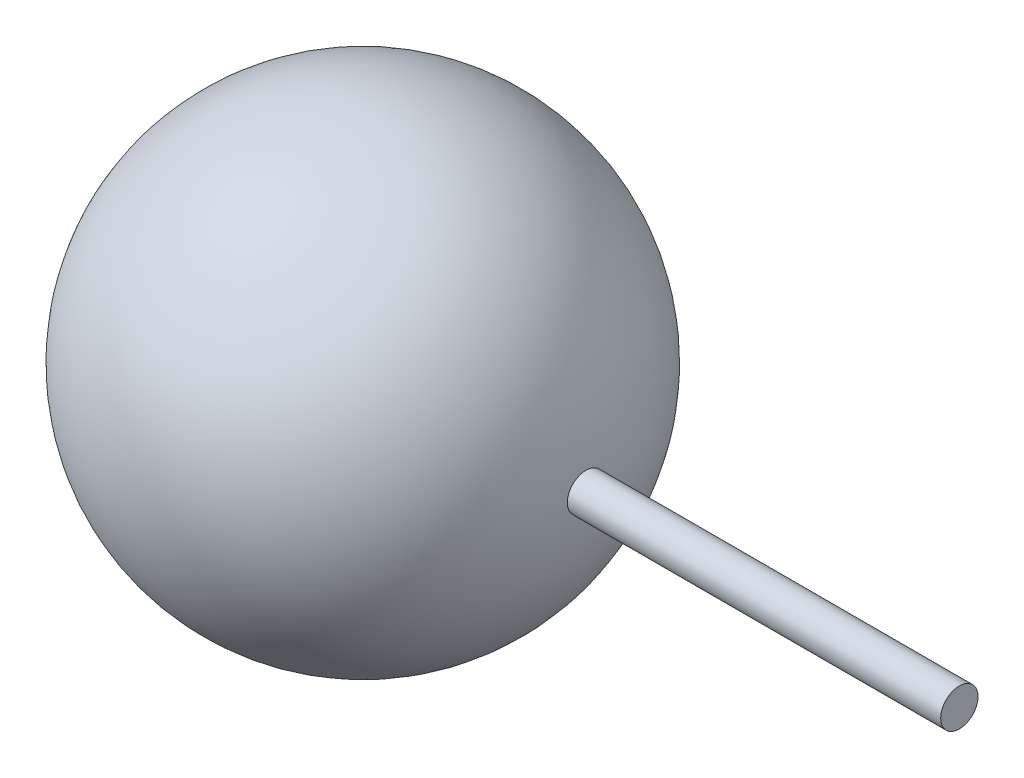
ISO-10303-21;
HEADER;
FILE_DESCRIPTION(('STEP AP214'),'2;1');
FILE_NAME('part.step','',(''),(''),'','','');
FILE_SCHEMA(('AUTOMOTIVE_DESIGN { 1 0 10303 214 1 1 1 1 }'));
ENDSEC;
DATA;
#1=APPLICATION_CONTEXT('core data for automotive mechanical design processes');
#2=APPLICATION_PROTOCOL_DEFINITION('international standard','automotive_design',2000,#1);
#3=PRODUCT_CONTEXT('',#1,'mechanical');
#4=PRODUCT('Part','Part','',(#3));
#5=PRODUCT_RELATED_PRODUCT_CATEGORY('part','',(#4));
#6=PRODUCT_DEFINITION_FORMATION('','',#4);
#7=PRODUCT_DEFINITION_CONTEXT('part definition',#1,'design');
#8=PRODUCT_DEFINITION('design','',#6,#7);
#9=PRODUCT_DEFINITION_SHAPE('','',#8);
#10=(LENGTH_UNIT() NAMED_UNIT(*) SI_UNIT(.MILLI.,.METRE.));
#11=(NAMED_UNIT(*) PLANE_ANGLE_UNIT() SI_UNIT($,.RADIAN.));
#12=(NAMED_UNIT(*) SI_UNIT($,.STERADIAN.) SOLID_ANGLE_UNIT());
#13=UNCERTAINTY_MEASURE_WITH_UNIT(LENGTH_MEASURE(1.E-05),#10,'distance_accuracy_value','');
#14=(GEOMETRIC_REPRESENTATION_CONTEXT(3) GLOBAL_UNCERTAINTY_ASSIGNED_CONTEXT((#13)) GLOBAL_UNIT_ASSIGNED_CONTEXT((#10,
#11,#12)) REPRESENTATION_CONTEXT('',''));
#15=CARTESIAN_POINT('',(0.,0.,0.));
#16=DIRECTION('',(0.,0.,1.));
#17=DIRECTION('',(1.,0.,0.));
#18=AXIS2_PLACEMENT_3D('',#15,#16,#17);
#19=CARTESIAN_POINT('',(0.,0.,0.));
#20=DIRECTION('',(-1.,0.,0.));
#21=DIRECTION('',(0.,1.,0.));
#22=AXIS2_PLACEMENT_3D('',#19,#20,#21);
#23=SPHERICAL_SURFACE('',#22,3.);
#24=CARTESIAN_POINT('',(2.98956518577535,0.,0.));
#25=DIRECTION('',(-1.,0.,0.));
#26=DIRECTION('',(0.,0.,1.));
#27=AXIS2_PLACEMENT_3D('',#24,#25,#26);
#28=CIRCLE('',#27,0.249999999999999);
#29=CARTESIAN_POINT('',(2.98956518577535,0.,0.249999999999999));
#30=VERTEX_POINT('',#29);
#31=EDGE_CURVE('E10',#30,#30,#28,.T.);
#32=ORIENTED_EDGE('',*,*,#31,.T.);
#33=EDGE_LOOP('',(#32));
#34=FACE_BOUND('',#33,.T.);
#35=ADVANCED_FACE('F35',(#34),#23,.T.);
#36=CARTESIAN_POINT('',(0.,0.,0.));
#37=DIRECTION('',(-1.,0.,0.));
#38=DIRECTION('',(0.,0.,1.));
#39=AXIS2_PLACEMENT_3D('',#36,#37,#38);
#40=CYLINDRICAL_SURFACE('',#39,0.249999999999999);
#41=ORIENTED_EDGE('',*,*,#31,.F.);
#42=EDGE_LOOP('',(#41));
#43=FACE_BOUND('',#42,.T.);
#44=CARTESIAN_POINT('',(7.98956518577535,0.,0.));
#45=DIRECTION('',(-1.,0.,0.));
#46=DIRECTION('',(0.,0.,1.));
#47=AXIS2_PLACEMENT_3D('',#44,#45,#46);
#48=CIRCLE('',#47,0.249999999999999);
#49=CARTESIAN_POINT('',(7.98956518577535,0.,0.249999999999999));
#50=VERTEX_POINT('',#49);
#51=EDGE_CURVE('E41',#50,#50,#48,.T.);
#52=ORIENTED_EDGE('',*,*,#51,.T.);
#53=EDGE_LOOP('',(#52));
#54=FACE_BOUND('',#53,.T.);
#55=ADVANCED_FACE('F47',(#43,#54),#40,.T.);
#56=CARTESIAN_POINT('',(7.98956518577535,0.249999999999999,0.));
#57=DIRECTION('',(-1.,0.,0.));
#58=DIRECTION('',(0.,0.,1.));
#59=AXIS2_PLACEMENT_3D('',#56,#57,#58);
#60=PLANE('',#59);
#61=ORIENTED_EDGE('',*,*,#51,.F.);
#62=EDGE_LOOP('',(#61));
#63=FACE_BOUND('',#62,.T.);
#64=ADVANCED_FACE('F49',(#63),#60,.F.);
#65=CLOSED_SHELL('',(#35,#55,#64));
#66=MANIFOLD_SOLID_BREP('B2',#65);
#67=ADVANCED_BREP_SHAPE_REPRESENTATION('',(#18,#66),#14);
#68=SHAPE_DEFINITION_REPRESENTATION(#9,#67);
ENDSEC;
END-ISO-10303-21;
